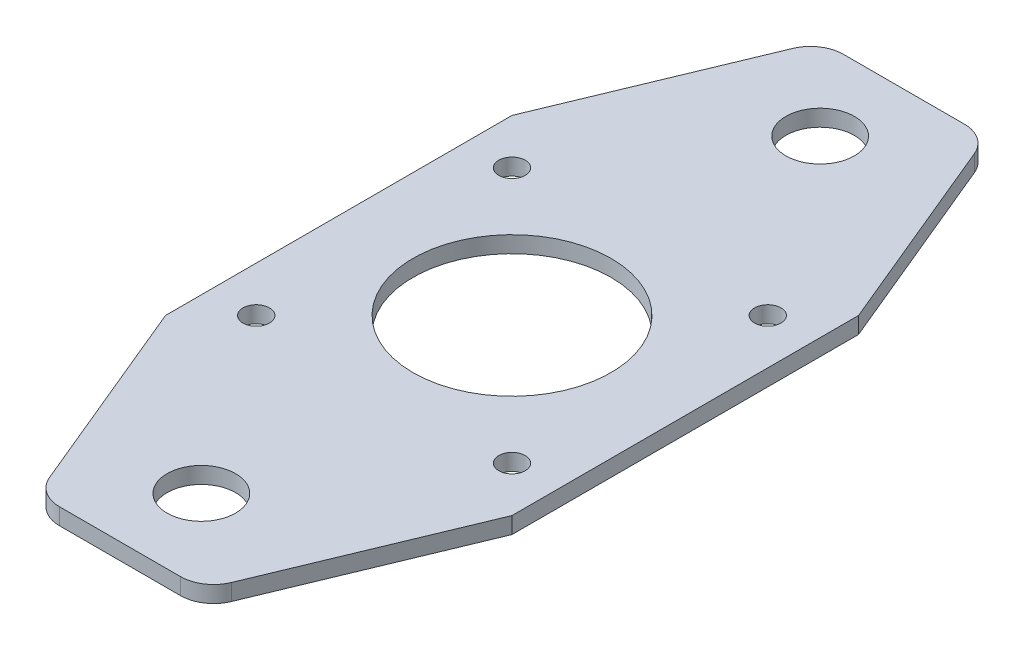
ISO-10303-21;
HEADER;
FILE_DESCRIPTION(('STEP AP214'),'2;1');
FILE_NAME('part.step','',(''),(''),'','','');
FILE_SCHEMA(('AUTOMOTIVE_DESIGN { 1 0 10303 214 1 1 1 1 }'));
ENDSEC;
DATA;
#1=APPLICATION_CONTEXT('core data for automotive mechanical design processes');
#2=APPLICATION_PROTOCOL_DEFINITION('international standard','automotive_design',2000,#1);
#3=PRODUCT_CONTEXT('',#1,'mechanical');
#4=PRODUCT('Part','Part','',(#3));
#5=PRODUCT_RELATED_PRODUCT_CATEGORY('part','',(#4));
#6=PRODUCT_DEFINITION_FORMATION('','',#4);
#7=PRODUCT_DEFINITION_CONTEXT('part definition',#1,'design');
#8=PRODUCT_DEFINITION('design','',#6,#7);
#9=PRODUCT_DEFINITION_SHAPE('','',#8);
#10=(LENGTH_UNIT() NAMED_UNIT(*) SI_UNIT(.MILLI.,.METRE.));
#11=(NAMED_UNIT(*) PLANE_ANGLE_UNIT() SI_UNIT($,.RADIAN.));
#12=(NAMED_UNIT(*) SI_UNIT($,.STERADIAN.) SOLID_ANGLE_UNIT());
#13=UNCERTAINTY_MEASURE_WITH_UNIT(LENGTH_MEASURE(1.E-05),#10,'distance_accuracy_value','');
#14=(GEOMETRIC_REPRESENTATION_CONTEXT(3) GLOBAL_UNCERTAINTY_ASSIGNED_CONTEXT((#13)) GLOBAL_UNIT_ASSIGNED_CONTEXT((#10,
#11,#12)) REPRESENTATION_CONTEXT('',''));
#15=CARTESIAN_POINT('',(0.,0.,0.));
#16=DIRECTION('',(0.,0.,1.));
#17=DIRECTION('',(1.,0.,0.));
#18=AXIS2_PLACEMENT_3D('',#15,#16,#17);
#19=CARTESIAN_POINT('',(7.32945909874608,2.,43.5));
#20=DIRECTION('',(0.,-1.,0.));
#21=DIRECTION('',(0.,0.,-1.));
#22=AXIS2_PLACEMENT_3D('',#19,#20,#21);
#23=CYLINDRICAL_SURFACE('',#22,3.99999999999999);
#24=CARTESIAN_POINT('',(7.32945909874608,0.,43.5));
#25=DIRECTION('',(0.,1.,0.));
#26=DIRECTION('',(0.,0.,1.));
#27=AXIS2_PLACEMENT_3D('',#24,#25,#26);
#28=CIRCLE('',#27,3.99999999999999);
#29=CARTESIAN_POINT('',(11.0238257527461,0.,45.0335106865661));
#30=VERTEX_POINT('',#29);
#31=CARTESIAN_POINT('',(7.32945909874608,0.,47.5));
#32=VERTEX_POINT('',#31);
#33=EDGE_CURVE('E175',#30,#32,#28,.F.);
#34=ORIENTED_EDGE('',*,*,#33,.F.);
#35=DIRECTION('',(0.,-1.,0.));
#36=VECTOR('',#35,1.);
#37=CARTESIAN_POINT('',(11.0238257527461,2.,45.0335106865661));
#38=LINE('',#37,#36);
#39=CARTESIAN_POINT('',(11.0238257527461,2.,45.0335106865661));
#40=VERTEX_POINT('',#39);
#41=EDGE_CURVE('E11',#40,#30,#38,.T.);
#42=ORIENTED_EDGE('',*,*,#41,.F.);
#43=CARTESIAN_POINT('',(7.32945909874608,2.,43.5));
#44=DIRECTION('',(0.,1.,0.));
#45=DIRECTION('',(0.,0.,1.));
#46=AXIS2_PLACEMENT_3D('',#43,#44,#45);
#47=CIRCLE('',#46,3.99999999999999);
#48=CARTESIAN_POINT('',(7.32945909874608,2.,47.5));
#49=VERTEX_POINT('',#48);
#50=EDGE_CURVE('E226',#40,#49,#47,.F.);
#51=ORIENTED_EDGE('',*,*,#50,.T.);
#52=DIRECTION('',(0.,-1.,0.));
#53=VECTOR('',#52,1.);
#54=CARTESIAN_POINT('',(7.32945909874608,2.,47.5));
#55=LINE('',#54,#53);
#56=EDGE_CURVE('E97',#49,#32,#55,.T.);
#57=ORIENTED_EDGE('',*,*,#56,.T.);
#58=EDGE_LOOP('',(#34,#42,#51,#57));
#59=FACE_BOUND('',#58,.T.);
#60=ADVANCED_FACE('F35',(#59),#23,.T.);
#61=CARTESIAN_POINT('',(25.3492256301245,2.,10.5223200728819));
#62=DIRECTION('',(-0.923591663500017,0.,-0.383377671641517));
#63=DIRECTION('',(-0.383377671641517,0.,0.923591663500017));
#64=AXIS2_PLACEMENT_3D('',#61,#62,#63);
#65=PLANE('',#64);
#66=DIRECTION('',(0.383377671641517,0.,-0.923591663500017));
#67=VECTOR('',#66,1.);
#68=CARTESIAN_POINT('',(25.3492256301245,0.,10.5223200728819));
#69=LINE('',#68,#67);
#70=CARTESIAN_POINT('',(21.,0.,21.));
#71=VERTEX_POINT('',#70);
#72=EDGE_CURVE('E178',#30,#71,#69,.T.);
#73=ORIENTED_EDGE('',*,*,#72,.T.);
#74=DIRECTION('',(0.,-1.,0.));
#75=VECTOR('',#74,1.);
#76=CARTESIAN_POINT('',(21.,2.,21.));
#77=LINE('',#76,#75);
#78=CARTESIAN_POINT('',(21.,2.,21.));
#79=VERTEX_POINT('',#78);
#80=EDGE_CURVE('E43',#79,#71,#77,.T.);
#81=ORIENTED_EDGE('',*,*,#80,.F.);
#82=DIRECTION('',(0.383377671641517,0.,-0.923591663500017));
#83=VECTOR('',#82,1.);
#84=CARTESIAN_POINT('',(25.3492256301245,2.,10.5223200728819));
#85=LINE('',#84,#83);
#86=EDGE_CURVE('E266',#40,#79,#85,.T.);
#87=ORIENTED_EDGE('',*,*,#86,.F.);
#88=ORIENTED_EDGE('',*,*,#41,.T.);
#89=EDGE_LOOP('',(#73,#81,#87,#88));
#90=FACE_BOUND('',#89,.T.);
#91=ADVANCED_FACE('F288',(#90),#65,.F.);
#92=CARTESIAN_POINT('',(21.,2.,0.));
#93=DIRECTION('',(-1.,0.,0.));
#94=DIRECTION('',(0.,0.,1.));
#95=AXIS2_PLACEMENT_3D('',#92,#93,#94);
#96=PLANE('',#95);
#97=DIRECTION('',(0.,0.,-1.));
#98=VECTOR('',#97,1.);
#99=CARTESIAN_POINT('',(21.,0.,0.));
#100=LINE('',#99,#98);
#101=CARTESIAN_POINT('',(21.,0.,-21.));
#102=VERTEX_POINT('',#101);
#103=EDGE_CURVE('E180',#71,#102,#100,.T.);
#104=ORIENTED_EDGE('',*,*,#103,.T.);
#105=DIRECTION('',(0.,-1.,0.));
#106=VECTOR('',#105,1.);
#107=CARTESIAN_POINT('',(21.,2.,-21.));
#108=LINE('',#107,#106);
#109=CARTESIAN_POINT('',(21.,2.,-21.));
#110=VERTEX_POINT('',#109);
#111=EDGE_CURVE('E240',#110,#102,#108,.T.);
#112=ORIENTED_EDGE('',*,*,#111,.F.);
#113=DIRECTION('',(0.,0.,-1.));
#114=VECTOR('',#113,1.);
#115=CARTESIAN_POINT('',(21.,2.,0.));
#116=LINE('',#115,#114);
#117=EDGE_CURVE('E248',#79,#110,#116,.T.);
#118=ORIENTED_EDGE('',*,*,#117,.F.);
#119=ORIENTED_EDGE('',*,*,#80,.T.);
#120=EDGE_LOOP('',(#104,#112,#118,#119));
#121=FACE_BOUND('',#120,.T.);
#122=ADVANCED_FACE('F246',(#121),#96,.F.);
#123=CARTESIAN_POINT('',(25.3492256301245,2.,-10.5223200728819));
#124=DIRECTION('',(0.923591663500017,0.,-0.383377671641517));
#125=DIRECTION('',(-0.383377671641517,0.,-0.923591663500017));
#126=AXIS2_PLACEMENT_3D('',#123,#124,#125);
#127=PLANE('',#126);
#128=DIRECTION('',(0.383377671641517,0.,0.923591663500017));
#129=VECTOR('',#128,1.);
#130=CARTESIAN_POINT('',(25.3492256301245,0.,-10.5223200728819));
#131=LINE('',#130,#129);
#132=CARTESIAN_POINT('',(11.0238257527461,0.,-45.0335106865661));
#133=VERTEX_POINT('',#132);
#134=EDGE_CURVE('E183',#133,#102,#131,.T.);
#135=ORIENTED_EDGE('',*,*,#134,.F.);
#136=DIRECTION('',(0.,-1.,0.));
#137=VECTOR('',#136,1.);
#138=CARTESIAN_POINT('',(11.0238257527461,2.,-45.0335106865661));
#139=LINE('',#138,#137);
#140=CARTESIAN_POINT('',(11.0238257527461,2.,-45.0335106865661));
#141=VERTEX_POINT('',#140);
#142=EDGE_CURVE('E238',#141,#133,#139,.T.);
#143=ORIENTED_EDGE('',*,*,#142,.F.);
#144=DIRECTION('',(0.383377671641517,0.,0.923591663500017));
#145=VECTOR('',#144,1.);
#146=CARTESIAN_POINT('',(25.3492256301245,2.,-10.5223200728819));
#147=LINE('',#146,#145);
#148=EDGE_CURVE('E261',#141,#110,#147,.T.);
#149=ORIENTED_EDGE('',*,*,#148,.T.);
#150=ORIENTED_EDGE('',*,*,#111,.T.);
#151=EDGE_LOOP('',(#135,#143,#149,#150));
#152=FACE_BOUND('',#151,.T.);
#153=ADVANCED_FACE('F257',(#152),#127,.T.);
#154=CARTESIAN_POINT('',(7.32945909874608,2.,-43.5));
#155=DIRECTION('',(0.,-1.,0.));
#156=DIRECTION('',(0.,0.,-1.));
#157=AXIS2_PLACEMENT_3D('',#154,#155,#156);
#158=CYLINDRICAL_SURFACE('',#157,3.99999999999999);
#159=CARTESIAN_POINT('',(7.32945909874608,0.,-43.5));
#160=DIRECTION('',(0.,1.,0.));
#161=DIRECTION('',(0.,0.,1.));
#162=AXIS2_PLACEMENT_3D('',#159,#160,#161);
#163=CIRCLE('',#162,3.99999999999999);
#164=CARTESIAN_POINT('',(7.32945909874608,0.,-47.5));
#165=VERTEX_POINT('',#164);
#166=EDGE_CURVE('E186',#133,#165,#163,.T.);
#167=ORIENTED_EDGE('',*,*,#166,.T.);
#168=DIRECTION('',(0.,-1.,0.));
#169=VECTOR('',#168,1.);
#170=CARTESIAN_POINT('',(7.32945909874608,2.,-47.5));
#171=LINE('',#170,#169);
#172=CARTESIAN_POINT('',(7.32945909874608,2.,-47.5));
#173=VERTEX_POINT('',#172);
#174=EDGE_CURVE('E236',#173,#165,#171,.T.);
#175=ORIENTED_EDGE('',*,*,#174,.F.);
#176=CARTESIAN_POINT('',(7.32945909874608,2.,-43.5));
#177=DIRECTION('',(0.,1.,0.));
#178=DIRECTION('',(0.,0.,1.));
#179=AXIS2_PLACEMENT_3D('',#176,#177,#178);
#180=CIRCLE('',#179,3.99999999999999);
#181=EDGE_CURVE('E262',#141,#173,#180,.T.);
#182=ORIENTED_EDGE('',*,*,#181,.F.);
#183=ORIENTED_EDGE('',*,*,#142,.T.);
#184=EDGE_LOOP('',(#167,#175,#182,#183));
#185=FACE_BOUND('',#184,.T.);
#186=ADVANCED_FACE('F298',(#185),#158,.T.);
#187=CARTESIAN_POINT('',(0.,2.,-47.5));
#188=DIRECTION('',(0.,0.,-1.));
#189=DIRECTION('',(-1.,0.,0.));
#190=AXIS2_PLACEMENT_3D('',#187,#188,#189);
#191=PLANE('',#190);
#192=DIRECTION('',(1.,0.,0.));
#193=VECTOR('',#192,1.);
#194=CARTESIAN_POINT('',(0.,0.,-47.5));
#195=LINE('',#194,#193);
#196=CARTESIAN_POINT('',(-7.32945909874608,0.,-47.5));
#197=VERTEX_POINT('',#196);
#198=EDGE_CURVE('E189',#197,#165,#195,.T.);
#199=ORIENTED_EDGE('',*,*,#198,.F.);
#200=DIRECTION('',(0.,-1.,0.));
#201=VECTOR('',#200,1.);
#202=CARTESIAN_POINT('',(-7.32945909874608,2.,-47.5));
#203=LINE('',#202,#201);
#204=CARTESIAN_POINT('',(-7.32945909874608,2.,-47.5));
#205=VERTEX_POINT('',#204);
#206=EDGE_CURVE('E234',#205,#197,#203,.T.);
#207=ORIENTED_EDGE('',*,*,#206,.F.);
#208=DIRECTION('',(1.,0.,0.));
#209=VECTOR('',#208,1.);
#210=CARTESIAN_POINT('',(0.,2.,-47.5));
#211=LINE('',#210,#209);
#212=EDGE_CURVE('E264',#205,#173,#211,.T.);
#213=ORIENTED_EDGE('',*,*,#212,.T.);
#214=ORIENTED_EDGE('',*,*,#174,.T.);
#215=EDGE_LOOP('',(#199,#207,#213,#214));
#216=FACE_BOUND('',#215,.T.);
#217=ADVANCED_FACE('F301',(#216),#191,.T.);
#218=CARTESIAN_POINT('',(-7.32945909874608,2.,-43.5));
#219=DIRECTION('',(0.,-1.,0.));
#220=DIRECTION('',(0.,0.,-1.));
#221=AXIS2_PLACEMENT_3D('',#218,#219,#220);
#222=CYLINDRICAL_SURFACE('',#221,3.99999999999999);
#223=CARTESIAN_POINT('',(-7.32945909874608,0.,-43.5));
#224=DIRECTION('',(0.,1.,0.));
#225=DIRECTION('',(0.,0.,1.));
#226=AXIS2_PLACEMENT_3D('',#223,#224,#225);
#227=CIRCLE('',#226,3.99999999999999);
#228=CARTESIAN_POINT('',(-11.0238257527461,0.,-45.0335106865661));
#229=VERTEX_POINT('',#228);
#230=EDGE_CURVE('E192',#229,#197,#227,.F.);
#231=ORIENTED_EDGE('',*,*,#230,.F.);
#232=DIRECTION('',(0.,-1.,0.));
#233=VECTOR('',#232,1.);
#234=CARTESIAN_POINT('',(-11.0238257527461,2.,-45.0335106865661));
#235=LINE('',#234,#233);
#236=CARTESIAN_POINT('',(-11.0238257527461,2.,-45.0335106865661));
#237=VERTEX_POINT('',#236);
#238=EDGE_CURVE('E232',#237,#229,#235,.T.);
#239=ORIENTED_EDGE('',*,*,#238,.F.);
#240=CARTESIAN_POINT('',(-7.32945909874608,2.,-43.5));
#241=DIRECTION('',(0.,1.,0.));
#242=DIRECTION('',(0.,0.,1.));
#243=AXIS2_PLACEMENT_3D('',#240,#241,#242);
#244=CIRCLE('',#243,3.99999999999999);
#245=EDGE_CURVE('E272',#237,#205,#244,.F.);
#246=ORIENTED_EDGE('',*,*,#245,.T.);
#247=ORIENTED_EDGE('',*,*,#206,.T.);
#248=EDGE_LOOP('',(#231,#239,#246,#247));
#249=FACE_BOUND('',#248,.T.);
#250=ADVANCED_FACE('F305',(#249),#222,.T.);
#251=CARTESIAN_POINT('',(-25.3492256301245,2.,-10.5223200728819));
#252=DIRECTION('',(0.923591663500017,0.,0.383377671641517));
#253=DIRECTION('',(0.383377671641517,0.,-0.923591663500017));
#254=AXIS2_PLACEMENT_3D('',#251,#252,#253);
#255=PLANE('',#254);
#256=DIRECTION('',(-0.383377671641517,0.,0.923591663500017));
#257=VECTOR('',#256,1.);
#258=CARTESIAN_POINT('',(-25.3492256301245,0.,-10.5223200728819));
#259=LINE('',#258,#257);
#260=CARTESIAN_POINT('',(-21.,0.,-21.));
#261=VERTEX_POINT('',#260);
#262=EDGE_CURVE('E195',#229,#261,#259,.T.);
#263=ORIENTED_EDGE('',*,*,#262,.T.);
#264=DIRECTION('',(0.,-1.,0.));
#265=VECTOR('',#264,1.);
#266=CARTESIAN_POINT('',(-21.,2.,-21.));
#267=LINE('',#266,#265);
#268=CARTESIAN_POINT('',(-21.,2.,-21.));
#269=VERTEX_POINT('',#268);
#270=EDGE_CURVE('E230',#269,#261,#267,.T.);
#271=ORIENTED_EDGE('',*,*,#270,.F.);
#272=DIRECTION('',(-0.383377671641517,0.,0.923591663500017));
#273=VECTOR('',#272,1.);
#274=CARTESIAN_POINT('',(-25.3492256301245,2.,-10.5223200728819));
#275=LINE('',#274,#273);
#276=EDGE_CURVE('E149',#237,#269,#275,.T.);
#277=ORIENTED_EDGE('',*,*,#276,.F.);
#278=ORIENTED_EDGE('',*,*,#238,.T.);
#279=EDGE_LOOP('',(#263,#271,#277,#278));
#280=FACE_BOUND('',#279,.T.);
#281=ADVANCED_FACE('F279',(#280),#255,.F.);
#282=CARTESIAN_POINT('',(-21.,2.,0.));
#283=DIRECTION('',(-1.,0.,0.));
#284=DIRECTION('',(0.,0.,1.));
#285=AXIS2_PLACEMENT_3D('',#282,#283,#284);
#286=PLANE('',#285);
#287=DIRECTION('',(0.,0.,-1.));
#288=VECTOR('',#287,1.);
#289=CARTESIAN_POINT('',(-21.,0.,0.));
#290=LINE('',#289,#288);
#291=CARTESIAN_POINT('',(-21.,0.,21.));
#292=VERTEX_POINT('',#291);
#293=EDGE_CURVE('E198',#292,#261,#290,.T.);
#294=ORIENTED_EDGE('',*,*,#293,.F.);
#295=DIRECTION('',(0.,-1.,0.));
#296=VECTOR('',#295,1.);
#297=CARTESIAN_POINT('',(-21.,2.,21.));
#298=LINE('',#297,#296);
#299=CARTESIAN_POINT('',(-21.,2.,21.));
#300=VERTEX_POINT('',#299);
#301=EDGE_CURVE('E137',#300,#292,#298,.T.);
#302=ORIENTED_EDGE('',*,*,#301,.F.);
#303=DIRECTION('',(0.,0.,-1.));
#304=VECTOR('',#303,1.);
#305=CARTESIAN_POINT('',(-21.,2.,0.));
#306=LINE('',#305,#304);
#307=EDGE_CURVE('E147',#300,#269,#306,.T.);
#308=ORIENTED_EDGE('',*,*,#307,.T.);
#309=ORIENTED_EDGE('',*,*,#270,.T.);
#310=EDGE_LOOP('',(#294,#302,#308,#309));
#311=FACE_BOUND('',#310,.T.);
#312=ADVANCED_FACE('F283',(#311),#286,.T.);
#313=CARTESIAN_POINT('',(-25.3492256301245,2.,10.5223200728819));
#314=DIRECTION('',(-0.923591663500017,0.,0.383377671641518));
#315=DIRECTION('',(0.383377671641518,0.,0.923591663500017));
#316=AXIS2_PLACEMENT_3D('',#313,#314,#315);
#317=PLANE('',#316);
#318=DIRECTION('',(-0.383377671641518,0.,-0.923591663500017));
#319=VECTOR('',#318,1.);
#320=CARTESIAN_POINT('',(-25.3492256301245,0.,10.5223200728819));
#321=LINE('',#320,#319);
#322=CARTESIAN_POINT('',(-11.0238257527461,0.,45.0335106865661));
#323=VERTEX_POINT('',#322);
#324=EDGE_CURVE('E136',#323,#292,#321,.T.);
#325=ORIENTED_EDGE('',*,*,#324,.F.);
#326=DIRECTION('',(0.,-1.,0.));
#327=VECTOR('',#326,1.);
#328=CARTESIAN_POINT('',(-11.0238257527461,2.,45.0335106865661));
#329=LINE('',#328,#327);
#330=CARTESIAN_POINT('',(-11.0238257527461,2.,45.0335106865661));
#331=VERTEX_POINT('',#330);
#332=EDGE_CURVE('E130',#331,#323,#329,.T.);
#333=ORIENTED_EDGE('',*,*,#332,.F.);
#334=DIRECTION('',(-0.383377671641518,0.,-0.923591663500017));
#335=VECTOR('',#334,1.);
#336=CARTESIAN_POINT('',(-25.3492256301245,2.,10.5223200728819));
#337=LINE('',#336,#335);
#338=EDGE_CURVE('E134',#331,#300,#337,.T.);
#339=ORIENTED_EDGE('',*,*,#338,.T.);
#340=ORIENTED_EDGE('',*,*,#301,.T.);
#341=EDGE_LOOP('',(#325,#333,#339,#340));
#342=FACE_BOUND('',#341,.T.);
#343=ADVANCED_FACE('F132',(#342),#317,.T.);
#344=CARTESIAN_POINT('',(-7.32945909874606,2.,43.5));
#345=DIRECTION('',(0.,-1.,0.));
#346=DIRECTION('',(0.,0.,-1.));
#347=AXIS2_PLACEMENT_3D('',#344,#345,#346);
#348=CYLINDRICAL_SURFACE('',#347,3.99999999999999);
#349=CARTESIAN_POINT('',(-7.32945909874606,0.,43.5));
#350=DIRECTION('',(0.,1.,0.));
#351=DIRECTION('',(0.,0.,1.));
#352=AXIS2_PLACEMENT_3D('',#349,#350,#351);
#353=CIRCLE('',#352,3.99999999999999);
#354=CARTESIAN_POINT('',(-7.32945909874605,0.,47.5));
#355=VERTEX_POINT('',#354);
#356=EDGE_CURVE('E90',#323,#355,#353,.T.);
#357=ORIENTED_EDGE('',*,*,#356,.T.);
#358=DIRECTION('',(0.,-1.,0.));
#359=VECTOR('',#358,1.);
#360=CARTESIAN_POINT('',(-7.32945909874605,2.,47.5));
#361=LINE('',#360,#359);
#362=CARTESIAN_POINT('',(-7.32945909874605,2.,47.5));
#363=VERTEX_POINT('',#362);
#364=EDGE_CURVE('E138',#363,#355,#361,.T.);
#365=ORIENTED_EDGE('',*,*,#364,.F.);
#366=CARTESIAN_POINT('',(-7.32945909874606,2.,43.5));
#367=DIRECTION('',(0.,1.,0.));
#368=DIRECTION('',(0.,0.,1.));
#369=AXIS2_PLACEMENT_3D('',#366,#367,#368);
#370=CIRCLE('',#369,3.99999999999999);
#371=EDGE_CURVE('E140',#331,#363,#370,.T.);
#372=ORIENTED_EDGE('',*,*,#371,.F.);
#373=ORIENTED_EDGE('',*,*,#332,.T.);
#374=EDGE_LOOP('',(#357,#365,#372,#373));
#375=FACE_BOUND('',#374,.T.);
#376=ADVANCED_FACE('F141',(#375),#348,.T.);
#377=CARTESIAN_POINT('',(-15.5,2.,15.5));
#378=DIRECTION('',(0.,-1.,0.));
#379=DIRECTION('',(0.,0.,-1.));
#380=AXIS2_PLACEMENT_3D('',#377,#378,#379);
#381=CYLINDRICAL_SURFACE('',#380,1.6);
#382=CARTESIAN_POINT('',(-15.5,2.,15.5));
#383=DIRECTION('',(0.,1.,0.));
#384=DIRECTION('',(0.,0.,1.));
#385=AXIS2_PLACEMENT_3D('',#382,#383,#384);
#386=CIRCLE('',#385,1.6);
#387=CARTESIAN_POINT('',(-15.5,2.,17.1));
#388=VERTEX_POINT('',#387);
#389=EDGE_CURVE('E169',#388,#388,#386,.F.);
#390=ORIENTED_EDGE('',*,*,#389,.F.);
#391=EDGE_LOOP('',(#390));
#392=FACE_BOUND('',#391,.T.);
#393=CARTESIAN_POINT('',(-15.5,0.,15.5));
#394=DIRECTION('',(0.,1.,0.));
#395=DIRECTION('',(0.,0.,1.));
#396=AXIS2_PLACEMENT_3D('',#393,#394,#395);
#397=CIRCLE('',#396,1.6);
#398=CARTESIAN_POINT('',(-15.5,0.,17.1));
#399=VERTEX_POINT('',#398);
#400=EDGE_CURVE('E220',#399,#399,#397,.F.);
#401=ORIENTED_EDGE('',*,*,#400,.T.);
#402=EDGE_LOOP('',(#401));
#403=FACE_BOUND('',#402,.T.);
#404=ADVANCED_FACE('F318',(#392,#403),#381,.F.);
#405=CARTESIAN_POINT('',(15.5,2.,15.5));
#406=DIRECTION('',(0.,-1.,0.));
#407=DIRECTION('',(0.,0.,-1.));
#408=AXIS2_PLACEMENT_3D('',#405,#406,#407);
#409=CYLINDRICAL_SURFACE('',#408,1.6);
#410=CARTESIAN_POINT('',(15.5,2.,15.5));
#411=DIRECTION('',(0.,1.,0.));
#412=DIRECTION('',(0.,0.,1.));
#413=AXIS2_PLACEMENT_3D('',#410,#411,#412);
#414=CIRCLE('',#413,1.6);
#415=CARTESIAN_POINT('',(15.5,2.,17.1));
#416=VERTEX_POINT('',#415);
#417=EDGE_CURVE('E166',#416,#416,#414,.T.);
#418=ORIENTED_EDGE('',*,*,#417,.T.);
#419=EDGE_LOOP('',(#418));
#420=FACE_BOUND('',#419,.T.);
#421=CARTESIAN_POINT('',(15.5,0.,15.5));
#422=DIRECTION('',(0.,1.,0.));
#423=DIRECTION('',(0.,0.,1.));
#424=AXIS2_PLACEMENT_3D('',#421,#422,#423);
#425=CIRCLE('',#424,1.6);
#426=CARTESIAN_POINT('',(15.5,0.,17.1));
#427=VERTEX_POINT('',#426);
#428=EDGE_CURVE('E217',#427,#427,#425,.T.);
#429=ORIENTED_EDGE('',*,*,#428,.F.);
#430=EDGE_LOOP('',(#429));
#431=FACE_BOUND('',#430,.T.);
#432=ADVANCED_FACE('F337',(#420,#431),#409,.F.);
#433=CARTESIAN_POINT('',(0.,2.,0.));
#434=DIRECTION('',(0.,-1.,0.));
#435=DIRECTION('',(0.,0.,-1.));
#436=AXIS2_PLACEMENT_3D('',#433,#434,#435);
#437=CYLINDRICAL_SURFACE('',#436,12.);
#438=CARTESIAN_POINT('',(0.,2.,0.));
#439=DIRECTION('',(0.,1.,0.));
#440=DIRECTION('',(0.,0.,1.));
#441=AXIS2_PLACEMENT_3D('',#438,#439,#440);
#442=CIRCLE('',#441,12.);
#443=CARTESIAN_POINT('',(0.,2.,12.));
#444=VERTEX_POINT('',#443);
#445=EDGE_CURVE('E163',#444,#444,#442,.T.);
#446=ORIENTED_EDGE('',*,*,#445,.T.);
#447=EDGE_LOOP('',(#446));
#448=FACE_BOUND('',#447,.T.);
#449=CARTESIAN_POINT('',(0.,0.,0.));
#450=DIRECTION('',(0.,1.,0.));
#451=DIRECTION('',(0.,0.,1.));
#452=AXIS2_PLACEMENT_3D('',#449,#450,#451);
#453=CIRCLE('',#452,12.);
#454=CARTESIAN_POINT('',(0.,0.,12.));
#455=VERTEX_POINT('',#454);
#456=EDGE_CURVE('E214',#455,#455,#453,.T.);
#457=ORIENTED_EDGE('',*,*,#456,.F.);
#458=EDGE_LOOP('',(#457));
#459=FACE_BOUND('',#458,.T.);
#460=ADVANCED_FACE('F333',(#448,#459),#437,.F.);
#461=CARTESIAN_POINT('',(-15.5,2.,-15.5));
#462=DIRECTION('',(0.,-1.,0.));
#463=DIRECTION('',(0.,0.,-1.));
#464=AXIS2_PLACEMENT_3D('',#461,#462,#463);
#465=CYLINDRICAL_SURFACE('',#464,1.6);
#466=CARTESIAN_POINT('',(-15.5,2.,-15.5));
#467=DIRECTION('',(0.,1.,0.));
#468=DIRECTION('',(0.,0.,1.));
#469=AXIS2_PLACEMENT_3D('',#466,#467,#468);
#470=CIRCLE('',#469,1.6);
#471=CARTESIAN_POINT('',(-15.5,2.,-13.9));
#472=VERTEX_POINT('',#471);
#473=EDGE_CURVE('E160',#472,#472,#470,.T.);
#474=ORIENTED_EDGE('',*,*,#473,.T.);
#475=EDGE_LOOP('',(#474));
#476=FACE_BOUND('',#475,.T.);
#477=CARTESIAN_POINT('',(-15.5,0.,-15.5));
#478=DIRECTION('',(0.,1.,0.));
#479=DIRECTION('',(0.,0.,1.));
#480=AXIS2_PLACEMENT_3D('',#477,#478,#479);
#481=CIRCLE('',#480,1.6);
#482=CARTESIAN_POINT('',(-15.5,0.,-13.9));
#483=VERTEX_POINT('',#482);
#484=EDGE_CURVE('E211',#483,#483,#481,.T.);
#485=ORIENTED_EDGE('',*,*,#484,.F.);
#486=EDGE_LOOP('',(#485));
#487=FACE_BOUND('',#486,.T.);
#488=ADVANCED_FACE('F329',(#476,#487),#465,.F.);
#489=CARTESIAN_POINT('',(15.5,2.,-15.5));
#490=DIRECTION('',(0.,-1.,0.));
#491=DIRECTION('',(0.,0.,-1.));
#492=AXIS2_PLACEMENT_3D('',#489,#490,#491);
#493=CYLINDRICAL_SURFACE('',#492,1.6);
#494=CARTESIAN_POINT('',(15.5,2.,-15.5));
#495=DIRECTION('',(0.,1.,0.));
#496=DIRECTION('',(0.,0.,1.));
#497=AXIS2_PLACEMENT_3D('',#494,#495,#496);
#498=CIRCLE('',#497,1.6);
#499=CARTESIAN_POINT('',(15.5,2.,-13.9));
#500=VERTEX_POINT('',#499);
#501=EDGE_CURVE('E157',#500,#500,#498,.F.);
#502=ORIENTED_EDGE('',*,*,#501,.F.);
#503=EDGE_LOOP('',(#502));
#504=FACE_BOUND('',#503,.T.);
#505=CARTESIAN_POINT('',(15.5,0.,-15.5));
#506=DIRECTION('',(0.,1.,0.));
#507=DIRECTION('',(0.,0.,1.));
#508=AXIS2_PLACEMENT_3D('',#505,#506,#507);
#509=CIRCLE('',#508,1.6);
#510=CARTESIAN_POINT('',(15.5,0.,-13.9));
#511=VERTEX_POINT('',#510);
#512=EDGE_CURVE('E208',#511,#511,#509,.F.);
#513=ORIENTED_EDGE('',*,*,#512,.T.);
#514=EDGE_LOOP('',(#513));
#515=FACE_BOUND('',#514,.T.);
#516=ADVANCED_FACE('F325',(#504,#515),#493,.F.);
#517=CARTESIAN_POINT('',(-0.154657952031087,2.,37.5));
#518=DIRECTION('',(0.,-1.,0.));
#519=DIRECTION('',(0.,0.,-1.));
#520=AXIS2_PLACEMENT_3D('',#517,#518,#519);
#521=CYLINDRICAL_SURFACE('',#520,4.15);
#522=CARTESIAN_POINT('',(-0.154657952031087,2.,37.5));
#523=DIRECTION('',(0.,1.,0.));
#524=DIRECTION('',(0.,0.,1.));
#525=AXIS2_PLACEMENT_3D('',#522,#523,#524);
#526=CIRCLE('',#525,4.15);
#527=CARTESIAN_POINT('',(-0.154657952031087,2.,41.65));
#528=VERTEX_POINT('',#527);
#529=EDGE_CURVE('E154',#528,#528,#526,.F.);
#530=ORIENTED_EDGE('',*,*,#529,.F.);
#531=EDGE_LOOP('',(#530));
#532=FACE_BOUND('',#531,.T.);
#533=CARTESIAN_POINT('',(-0.154657952031087,0.,37.5));
#534=DIRECTION('',(0.,1.,0.));
#535=DIRECTION('',(0.,0.,1.));
#536=AXIS2_PLACEMENT_3D('',#533,#534,#535);
#537=CIRCLE('',#536,4.15);
#538=CARTESIAN_POINT('',(-0.154657952031087,0.,41.65));
#539=VERTEX_POINT('',#538);
#540=EDGE_CURVE('E205',#539,#539,#537,.F.);
#541=ORIENTED_EDGE('',*,*,#540,.T.);
#542=EDGE_LOOP('',(#541));
#543=FACE_BOUND('',#542,.T.);
#544=ADVANCED_FACE('F322',(#532,#543),#521,.F.);
#545=CARTESIAN_POINT('',(0.,2.,47.5));
#546=DIRECTION('',(0.,0.,-1.));
#547=DIRECTION('',(-1.,0.,0.));
#548=AXIS2_PLACEMENT_3D('',#545,#546,#547);
#549=PLANE('',#548);
#550=DIRECTION('',(1.,0.,0.));
#551=VECTOR('',#550,1.);
#552=CARTESIAN_POINT('',(0.,0.,47.5));
#553=LINE('',#552,#551);
#554=EDGE_CURVE('E203',#355,#32,#553,.T.);
#555=ORIENTED_EDGE('',*,*,#554,.T.);
#556=ORIENTED_EDGE('',*,*,#56,.F.);
#557=DIRECTION('',(1.,0.,0.));
#558=VECTOR('',#557,1.);
#559=CARTESIAN_POINT('',(0.,2.,47.5));
#560=LINE('',#559,#558);
#561=EDGE_CURVE('E51',#363,#49,#560,.T.);
#562=ORIENTED_EDGE('',*,*,#561,.F.);
#563=ORIENTED_EDGE('',*,*,#364,.T.);
#564=EDGE_LOOP('',(#555,#556,#562,#563));
#565=FACE_BOUND('',#564,.T.);
#566=ADVANCED_FACE('F286',(#565),#549,.F.);
#567=CARTESIAN_POINT('',(-0.154657952031087,2.,-37.5));
#568=DIRECTION('',(0.,-1.,0.));
#569=DIRECTION('',(0.,0.,-1.));
#570=AXIS2_PLACEMENT_3D('',#567,#568,#569);
#571=CYLINDRICAL_SURFACE('',#570,4.15);
#572=CARTESIAN_POINT('',(-0.154657952031087,2.,-37.5));
#573=DIRECTION('',(0.,1.,0.));
#574=DIRECTION('',(0.,0.,1.));
#575=AXIS2_PLACEMENT_3D('',#572,#573,#574);
#576=CIRCLE('',#575,4.15);
#577=CARTESIAN_POINT('',(-0.154657952031087,2.,-33.35));
#578=VERTEX_POINT('',#577);
#579=EDGE_CURVE('E172',#578,#578,#576,.T.);
#580=ORIENTED_EDGE('',*,*,#579,.T.);
#581=EDGE_LOOP('',(#580));
#582=FACE_BOUND('',#581,.T.);
#583=CARTESIAN_POINT('',(-0.154657952031087,0.,-37.5));
#584=DIRECTION('',(0.,1.,0.));
#585=DIRECTION('',(0.,0.,1.));
#586=AXIS2_PLACEMENT_3D('',#583,#584,#585);
#587=CIRCLE('',#586,4.15);
#588=CARTESIAN_POINT('',(-0.154657952031087,0.,-33.35));
#589=VERTEX_POINT('',#588);
#590=EDGE_CURVE('E223',#589,#589,#587,.T.);
#591=ORIENTED_EDGE('',*,*,#590,.F.);
#592=EDGE_LOOP('',(#591));
#593=FACE_BOUND('',#592,.T.);
#594=ADVANCED_FACE('F321',(#582,#593),#571,.F.);
#595=CARTESIAN_POINT('',(0.,2.,0.));
#596=DIRECTION('',(0.,1.,0.));
#597=DIRECTION('',(0.,0.,1.));
#598=AXIS2_PLACEMENT_3D('',#595,#596,#597);
#599=PLANE('',#598);
#600=ORIENTED_EDGE('',*,*,#50,.F.);
#601=ORIENTED_EDGE('',*,*,#86,.T.);
#602=ORIENTED_EDGE('',*,*,#117,.T.);
#603=ORIENTED_EDGE('',*,*,#148,.F.);
#604=ORIENTED_EDGE('',*,*,#181,.T.);
#605=ORIENTED_EDGE('',*,*,#212,.F.);
#606=ORIENTED_EDGE('',*,*,#245,.F.);
#607=ORIENTED_EDGE('',*,*,#276,.T.);
#608=ORIENTED_EDGE('',*,*,#307,.F.);
#609=ORIENTED_EDGE('',*,*,#338,.F.);
#610=ORIENTED_EDGE('',*,*,#371,.T.);
#611=ORIENTED_EDGE('',*,*,#561,.T.);
#612=EDGE_LOOP('',(#600,#601,#602,#603,#604,#605,#606,#607,#608,#609,#610,#611));
#613=FACE_BOUND('',#612,.T.);
#614=ORIENTED_EDGE('',*,*,#529,.T.);
#615=EDGE_LOOP('',(#614));
#616=FACE_BOUND('',#615,.T.);
#617=ORIENTED_EDGE('',*,*,#501,.T.);
#618=EDGE_LOOP('',(#617));
#619=FACE_BOUND('',#618,.T.);
#620=ORIENTED_EDGE('',*,*,#473,.F.);
#621=EDGE_LOOP('',(#620));
#622=FACE_BOUND('',#621,.T.);
#623=ORIENTED_EDGE('',*,*,#445,.F.);
#624=EDGE_LOOP('',(#623));
#625=FACE_BOUND('',#624,.T.);
#626=ORIENTED_EDGE('',*,*,#417,.F.);
#627=EDGE_LOOP('',(#626));
#628=FACE_BOUND('',#627,.T.);
#629=ORIENTED_EDGE('',*,*,#389,.T.);
#630=EDGE_LOOP('',(#629));
#631=FACE_BOUND('',#630,.T.);
#632=ORIENTED_EDGE('',*,*,#579,.F.);
#633=EDGE_LOOP('',(#632));
#634=FACE_BOUND('',#633,.T.);
#635=ADVANCED_FACE('F144',(#613,#616,#619,#622,#625,#628,#631,#634),#599,.T.);
#636=CARTESIAN_POINT('',(0.,0.,0.));
#637=DIRECTION('',(0.,1.,0.));
#638=DIRECTION('',(0.,0.,1.));
#639=AXIS2_PLACEMENT_3D('',#636,#637,#638);
#640=PLANE('',#639);
#641=ORIENTED_EDGE('',*,*,#33,.T.);
#642=ORIENTED_EDGE('',*,*,#554,.F.);
#643=ORIENTED_EDGE('',*,*,#356,.F.);
#644=ORIENTED_EDGE('',*,*,#324,.T.);
#645=ORIENTED_EDGE('',*,*,#293,.T.);
#646=ORIENTED_EDGE('',*,*,#262,.F.);
#647=ORIENTED_EDGE('',*,*,#230,.T.);
#648=ORIENTED_EDGE('',*,*,#198,.T.);
#649=ORIENTED_EDGE('',*,*,#166,.F.);
#650=ORIENTED_EDGE('',*,*,#134,.T.);
#651=ORIENTED_EDGE('',*,*,#103,.F.);
#652=ORIENTED_EDGE('',*,*,#72,.F.);
#653=EDGE_LOOP('',(#641,#642,#643,#644,#645,#646,#647,#648,#649,#650,#651,#652));
#654=FACE_BOUND('',#653,.T.);
#655=ORIENTED_EDGE('',*,*,#540,.F.);
#656=EDGE_LOOP('',(#655));
#657=FACE_BOUND('',#656,.T.);
#658=ORIENTED_EDGE('',*,*,#512,.F.);
#659=EDGE_LOOP('',(#658));
#660=FACE_BOUND('',#659,.T.);
#661=ORIENTED_EDGE('',*,*,#484,.T.);
#662=EDGE_LOOP('',(#661));
#663=FACE_BOUND('',#662,.T.);
#664=ORIENTED_EDGE('',*,*,#456,.T.);
#665=EDGE_LOOP('',(#664));
#666=FACE_BOUND('',#665,.T.);
#667=ORIENTED_EDGE('',*,*,#428,.T.);
#668=EDGE_LOOP('',(#667));
#669=FACE_BOUND('',#668,.T.);
#670=ORIENTED_EDGE('',*,*,#400,.F.);
#671=EDGE_LOOP('',(#670));
#672=FACE_BOUND('',#671,.T.);
#673=ORIENTED_EDGE('',*,*,#590,.T.);
#674=EDGE_LOOP('',(#673));
#675=FACE_BOUND('',#674,.T.);
#676=ADVANCED_FACE('F252',(#654,#657,#660,#663,#666,#669,#672,#675),#640,.F.);
#677=CLOSED_SHELL('',(#60,#91,#122,#153,#186,#217,#250,#281,#312,#343,#376,#404,#432,#460,#488,
#516,#544,#566,#594,#635,#676));
#678=MANIFOLD_SOLID_BREP('B2',#677);
#679=ADVANCED_BREP_SHAPE_REPRESENTATION('',(#18,#678),#14);
#680=SHAPE_DEFINITION_REPRESENTATION(#9,#679);
ENDSEC;
END-ISO-10303-21;
